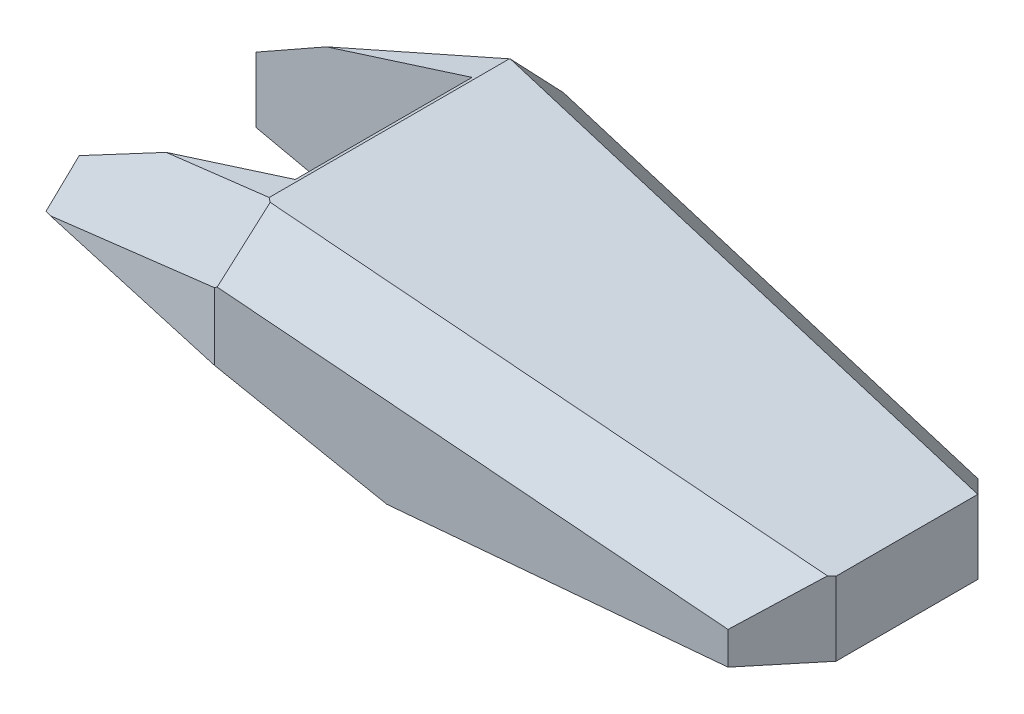
ISO-10303-21;
HEADER;
FILE_DESCRIPTION(('STEP AP214'),'2;1');
FILE_NAME('part.step','',(''),(''),'','','');
FILE_SCHEMA(('AUTOMOTIVE_DESIGN { 1 0 10303 214 1 1 1 1 }'));
ENDSEC;
DATA;
#1=APPLICATION_CONTEXT('core data for automotive mechanical design processes');
#2=APPLICATION_PROTOCOL_DEFINITION('international standard','automotive_design',2000,#1);
#3=PRODUCT_CONTEXT('',#1,'mechanical');
#4=PRODUCT('Part','Part','',(#3));
#5=PRODUCT_RELATED_PRODUCT_CATEGORY('part','',(#4));
#6=PRODUCT_DEFINITION_FORMATION('','',#4);
#7=PRODUCT_DEFINITION_CONTEXT('part definition',#1,'design');
#8=PRODUCT_DEFINITION('design','',#6,#7);
#9=PRODUCT_DEFINITION_SHAPE('','',#8);
#10=(LENGTH_UNIT() NAMED_UNIT(*) SI_UNIT(.MILLI.,.METRE.));
#11=(NAMED_UNIT(*) PLANE_ANGLE_UNIT() SI_UNIT($,.RADIAN.));
#12=(NAMED_UNIT(*) SI_UNIT($,.STERADIAN.) SOLID_ANGLE_UNIT());
#13=UNCERTAINTY_MEASURE_WITH_UNIT(LENGTH_MEASURE(1.E-05),#10,'distance_accuracy_value','');
#14=(GEOMETRIC_REPRESENTATION_CONTEXT(3) GLOBAL_UNCERTAINTY_ASSIGNED_CONTEXT((#13)) GLOBAL_UNIT_ASSIGNED_CONTEXT((#10,
#11,#12)) REPRESENTATION_CONTEXT('',''));
#15=CARTESIAN_POINT('',(0.,0.,0.));
#16=DIRECTION('',(0.,0.,1.));
#17=DIRECTION('',(1.,0.,0.));
#18=AXIS2_PLACEMENT_3D('',#15,#16,#17);
#19=CARTESIAN_POINT('',(75.,0.,35.));
#20=DIRECTION('',(0.,1.,0.));
#21=DIRECTION('',(-1.,0.,0.));
#22=AXIS2_PLACEMENT_3D('',#19,#20,#21);
#23=PLANE('',#22);
#24=DIRECTION('',(0.995536943294782,0.,-0.0943726365811719));
#25=VECTOR('',#24,1.);
#26=CARTESIAN_POINT('',(3.01675074396338,0.,31.8237035980696));
#27=LINE('',#26,#25);
#28=CARTESIAN_POINT('',(1.59268387258015,0.,31.958699035683));
#29=VERTEX_POINT('',#28);
#30=CARTESIAN_POINT('',(65.0446305670522,0.,25.9437263658117));
#31=VERTEX_POINT('',#30);
#32=EDGE_CURVE('E255',#29,#31,#27,.T.);
#33=ORIENTED_EDGE('',*,*,#32,.F.);
#34=DIRECTION('',(-0.975678950603205,0.,-0.219204437340644));
#35=VECTOR('',#34,1.);
#36=CARTESIAN_POINT('',(72.1231881248531,0.,47.804689656279));
#37=LINE('',#36,#35);
#38=CARTESIAN_POINT('',(-60.5374855352448,0.,18.));
#39=VERTEX_POINT('',#38);
#40=EDGE_CURVE('E321',#29,#39,#37,.T.);
#41=ORIENTED_EDGE('',*,*,#40,.T.);
#42=DIRECTION('',(1.,0.,0.));
#43=VECTOR('',#42,1.);
#44=CARTESIAN_POINT('',(0.,0.,18.));
#45=LINE('',#44,#43);
#46=CARTESIAN_POINT('',(-31.,0.,18.));
#47=VERTEX_POINT('',#46);
#48=EDGE_CURVE('E236',#39,#47,#45,.T.);
#49=ORIENTED_EDGE('',*,*,#48,.T.);
#50=DIRECTION('',(0.,0.,-1.));
#51=VECTOR('',#50,1.);
#52=CARTESIAN_POINT('',(-31.,0.,0.));
#53=LINE('',#52,#51);
#54=CARTESIAN_POINT('',(-31.,0.,-18.));
#55=VERTEX_POINT('',#54);
#56=EDGE_CURVE('E225',#47,#55,#53,.T.);
#57=ORIENTED_EDGE('',*,*,#56,.T.);
#58=DIRECTION('',(1.,0.,0.));
#59=VECTOR('',#58,1.);
#60=CARTESIAN_POINT('',(0.,0.,-18.));
#61=LINE('',#60,#59);
#62=CARTESIAN_POINT('',(-60.5374855352447,0.,-18.));
#63=VERTEX_POINT('',#62);
#64=EDGE_CURVE('E212',#63,#55,#61,.T.);
#65=ORIENTED_EDGE('',*,*,#64,.F.);
#66=DIRECTION('',(0.975678950603205,0.,-0.219204437340644));
#67=VECTOR('',#66,1.);
#68=CARTESIAN_POINT('',(-28.2979556265935,0.,-25.2432104939679));
#69=LINE('',#68,#67);
#70=CARTESIAN_POINT('',(1.59268387258016,0.,-31.958699035683));
#71=VERTEX_POINT('',#70);
#72=EDGE_CURVE('E325',#63,#71,#69,.T.);
#73=ORIENTED_EDGE('',*,*,#72,.T.);
#74=DIRECTION('',(0.995536943294782,0.,0.094372636581172));
#75=VECTOR('',#74,1.);
#76=CARTESIAN_POINT('',(3.01675074396338,0.,-31.8237035980697));
#77=LINE('',#76,#75);
#78=CARTESIAN_POINT('',(63.9527699235522,0.,-26.0472300764478));
#79=VERTEX_POINT('',#78);
#80=EDGE_CURVE('E244',#71,#79,#77,.T.);
#81=ORIENTED_EDGE('',*,*,#80,.T.);
#82=DIRECTION('',(0.707106781186545,0.,0.70710678118655));
#83=VECTOR('',#82,1.);
#84=CARTESIAN_POINT('',(63.9527699235522,0.,-26.0472300764478));
#85=LINE('',#84,#83);
#86=CARTESIAN_POINT('',(75.,0.,-15.));
#87=VERTEX_POINT('',#86);
#88=EDGE_CURVE('E103',#79,#87,#85,.T.);
#89=ORIENTED_EDGE('',*,*,#88,.T.);
#90=DIRECTION('',(0.,0.,-1.));
#91=VECTOR('',#90,1.);
#92=CARTESIAN_POINT('',(75.,0.,35.));
#93=LINE('',#92,#91);
#94=CARTESIAN_POINT('',(75.,0.,13.9032444743975));
#95=VERTEX_POINT('',#94);
#96=EDGE_CURVE('E253',#95,#87,#93,.T.);
#97=ORIENTED_EDGE('',*,*,#96,.F.);
#98=DIRECTION('',(0.637219392240469,0.,-0.770682454810467));
#99=VECTOR('',#98,1.);
#100=CARTESIAN_POINT('',(75.,0.,13.9032444743975));
#101=LINE('',#100,#99);
#102=EDGE_CURVE('E316',#95,#31,#101,.F.);
#103=ORIENTED_EDGE('',*,*,#102,.T.);
#104=EDGE_LOOP('',(#33,#41,#49,#57,#65,#73,#81,#89,#97,#103));
#105=FACE_BOUND('',#104,.T.);
#106=ADVANCED_FACE('F80',(#105),#23,.F.);
#107=CARTESIAN_POINT('',(-75.,0.,35.));
#108=DIRECTION('',(1.,0.,0.));
#109=DIRECTION('',(0.,0.,-1.));
#110=AXIS2_PLACEMENT_3D('',#107,#108,#109);
#111=PLANE('',#110);
#112=DIRECTION('',(0.,-0.69834922621373,-0.715757192242372));
#113=VECTOR('',#112,1.);
#114=CARTESIAN_POINT('',(-75.,17.4173625915818,32.6022574710627));
#115=LINE('',#114,#113);
#116=CARTESIAN_POINT('',(-75.,3.17024734577753,18.));
#117=VERTEX_POINT('',#116);
#118=CARTESIAN_POINT('',(-75.,9.76195981958891,24.7560261187721));
#119=VERTEX_POINT('',#118);
#120=EDGE_CURVE('E311',#117,#119,#115,.F.);
#121=ORIENTED_EDGE('',*,*,#120,.T.);
#122=DIRECTION('',(0.,-0.690102523626491,0.723711618591514));
#123=VECTOR('',#122,1.);
#124=CARTESIAN_POINT('',(-75.,20.1608731878628,13.8506690628404));
#125=LINE('',#124,#123);
#126=CARTESIAN_POINT('',(-75.,16.2042367631662,18.));
#127=VERTEX_POINT('',#126);
#128=EDGE_CURVE('E312',#119,#127,#125,.F.);
#129=ORIENTED_EDGE('',*,*,#128,.T.);
#130=DIRECTION('',(0.,-1.,0.));
#131=VECTOR('',#130,1.);
#132=CARTESIAN_POINT('',(-75.,34.2396301233684,18.));
#133=LINE('',#132,#131);
#134=EDGE_CURVE('E245',#127,#117,#133,.T.);
#135=ORIENTED_EDGE('',*,*,#134,.T.);
#136=EDGE_LOOP('',(#121,#129,#135));
#137=FACE_BOUND('',#136,.T.);
#138=ADVANCED_FACE('F411',(#137),#111,.F.);
#139=CARTESIAN_POINT('',(-75.,20.,35.));
#140=DIRECTION('',(0.303171054505346,-0.952936153008226,0.));
#141=DIRECTION('',(0.952936153008226,0.303171054505346,0.));
#142=AXIS2_PLACEMENT_3D('',#139,#140,#141);
#143=PLANE('',#142);
#144=DIRECTION('',(0.,0.,-1.));
#145=VECTOR('',#144,1.);
#146=CARTESIAN_POINT('',(-30.2415768313943,34.2396301233684,35.));
#147=LINE('',#146,#145);
#148=CARTESIAN_POINT('',(-30.2415768313943,34.2396301233684,24.0751899207849));
#149=VERTEX_POINT('',#148);
#150=CARTESIAN_POINT('',(-30.2415768313943,34.2396301233684,-24.8291976010852));
#151=VERTEX_POINT('',#150);
#152=EDGE_CURVE('E247',#149,#151,#147,.T.);
#153=ORIENTED_EDGE('',*,*,#152,.T.);
#154=DIRECTION('',(-0.931819694186912,-0.296452976837638,0.209350638999531));
#155=VECTOR('',#154,1.);
#156=CARTESIAN_POINT('',(-73.0050220744197,20.6346905398685,-15.2215936372511));
#157=LINE('',#156,#155);
#158=CARTESIAN_POINT('',(-60.6383353538242,24.5690794724163,-18.));
#159=VERTEX_POINT('',#158);
#160=EDGE_CURVE('E287',#151,#159,#157,.T.);
#161=ORIENTED_EDGE('',*,*,#160,.T.);
#162=DIRECTION('',(0.952936153008226,0.303171054505346,0.));
#163=VECTOR('',#162,1.);
#164=CARTESIAN_POINT('',(-75.,20.,-18.));
#165=LINE('',#164,#163);
#166=CARTESIAN_POINT('',(-31.,33.9983422353376,-18.));
#167=VERTEX_POINT('',#166);
#168=EDGE_CURVE('E259',#159,#167,#165,.T.);
#169=ORIENTED_EDGE('',*,*,#168,.T.);
#170=DIRECTION('',(0.,0.,-1.));
#171=VECTOR('',#170,1.);
#172=CARTESIAN_POINT('',(-31.,33.9983422353376,35.));
#173=LINE('',#172,#171);
#174=CARTESIAN_POINT('',(-31.,33.9983422353376,18.));
#175=VERTEX_POINT('',#174);
#176=EDGE_CURVE('E229',#175,#167,#173,.T.);
#177=ORIENTED_EDGE('',*,*,#176,.F.);
#178=DIRECTION('',(0.952936153008226,0.303171054505346,0.));
#179=VECTOR('',#178,1.);
#180=CARTESIAN_POINT('',(-75.,20.,18.));
#181=LINE('',#180,#179);
#182=CARTESIAN_POINT('',(-57.2822471688078,25.6367992675489,18.));
#183=VERTEX_POINT('',#182);
#184=EDGE_CURVE('E265',#183,#175,#181,.T.);
#185=ORIENTED_EDGE('',*,*,#184,.F.);
#186=DIRECTION('',(0.931819694186913,0.296452976837638,0.209350638999531));
#187=VECTOR('',#186,1.);
#188=CARTESIAN_POINT('',(-70.9071619975642,21.3021124334521,14.9389092723531));
#189=LINE('',#188,#187);
#190=EDGE_CURVE('E290',#183,#149,#189,.T.);
#191=ORIENTED_EDGE('',*,*,#190,.T.);
#192=EDGE_LOOP('',(#153,#161,#169,#177,#185,#191));
#193=FACE_BOUND('',#192,.T.);
#194=ADVANCED_FACE('F375',(#193),#143,.F.);
#195=DIRECTION('',(0.,-1.,0.));
#196=VECTOR('',#195,1.);
#197=CARTESIAN_POINT('',(-75.,34.2396301233684,-18.));
#198=LINE('',#197,#196);
#199=CARTESIAN_POINT('',(-75.,16.4528024144489,-18.));
#200=VERTEX_POINT('',#199);
#201=CARTESIAN_POINT('',(-75.,3.1702473457776,-18.));
#202=VERTEX_POINT('',#201);
#203=EDGE_CURVE('E235',#200,#202,#198,.T.);
#204=ORIENTED_EDGE('',*,*,#203,.F.);
#205=DIRECTION('',(0.,-0.739743838551892,-0.672888589087757));
#206=VECTOR('',#205,1.);
#207=CARTESIAN_POINT('',(-75.,12.9466069829281,-21.189318753368));
#208=LINE('',#207,#206);
#209=CARTESIAN_POINT('',(-75.,9.41569004807591,-24.4011247741248));
#210=VERTEX_POINT('',#209);
#211=EDGE_CURVE('E300',#200,#210,#208,.T.);
#212=ORIENTED_EDGE('',*,*,#211,.T.);
#213=DIRECTION('',(0.,-0.698349226213734,0.715757192242369));
#214=VECTOR('',#213,1.);
#215=CARTESIAN_POINT('',(-75.,14.8407122269419,-29.9613781500042));
#216=LINE('',#215,#214);
#217=EDGE_CURVE('E294',#210,#202,#216,.T.);
#218=ORIENTED_EDGE('',*,*,#217,.T.);
#219=EDGE_LOOP('',(#204,#212,#218));
#220=FACE_BOUND('',#219,.T.);
#221=ADVANCED_FACE('F379',(#220),#111,.F.);
#222=CARTESIAN_POINT('',(75.,15.,35.));
#223=DIRECTION('',(-1.,0.,0.));
#224=DIRECTION('',(0.,0.,1.));
#225=AXIS2_PLACEMENT_3D('',#222,#223,#224);
#226=PLANE('',#225);
#227=DIRECTION('',(0.,1.,0.));
#228=VECTOR('',#227,1.);
#229=CARTESIAN_POINT('',(75.,15.,-15.));
#230=LINE('',#229,#228);
#231=CARTESIAN_POINT('',(75.,14.9553293177054,-15.));
#232=VERTEX_POINT('',#231);
#233=EDGE_CURVE('E90',#87,#232,#230,.T.);
#234=ORIENTED_EDGE('',*,*,#233,.T.);
#235=DIRECTION('',(0.,0.717363049575828,0.696699544354141));
#236=VECTOR('',#235,1.);
#237=CARTESIAN_POINT('',(75.,8.15486525160468,-21.6045780014046));
#238=LINE('',#237,#236);
#239=CARTESIAN_POINT('',(75.,15.,-14.9566160481515));
#240=VERTEX_POINT('',#239);
#241=EDGE_CURVE('E12',#232,#240,#238,.T.);
#242=ORIENTED_EDGE('',*,*,#241,.T.);
#243=DIRECTION('',(0.,0.,-1.));
#244=VECTOR('',#243,1.);
#245=CARTESIAN_POINT('',(75.,15.,35.));
#246=LINE('',#245,#244);
#247=CARTESIAN_POINT('',(75.,15.,13.9032444743975));
#248=VERTEX_POINT('',#247);
#249=EDGE_CURVE('E252',#248,#240,#246,.T.);
#250=ORIENTED_EDGE('',*,*,#249,.F.);
#251=DIRECTION('',(0.,-1.,0.));
#252=VECTOR('',#251,1.);
#253=CARTESIAN_POINT('',(75.,15.,13.9032444743975));
#254=LINE('',#253,#252);
#255=EDGE_CURVE('E327',#248,#95,#254,.T.);
#256=ORIENTED_EDGE('',*,*,#255,.T.);
#257=ORIENTED_EDGE('',*,*,#96,.T.);
#258=EDGE_LOOP('',(#234,#242,#250,#256,#257));
#259=FACE_BOUND('',#258,.T.);
#260=ADVANCED_FACE('F363',(#259),#226,.F.);
#261=CARTESIAN_POINT('',(-30.2415768313943,34.2396301233684,35.));
#262=DIRECTION('',(-0.179833560165854,-0.983697052266639,0.));
#263=DIRECTION('',(0.983697052266639,-0.179833560165854,0.));
#264=AXIS2_PLACEMENT_3D('',#261,#262,#263);
#265=PLANE('',#264);
#266=DIRECTION('',(-0.979447820558124,0.17905674126175,-0.0928474566838682));
#267=VECTOR('',#266,1.);
#268=CARTESIAN_POINT('',(-31.154914525898,34.4066010102464,-25.0196470962033));
#269=LINE('',#268,#267);
#270=CARTESIAN_POINT('',(-30.1075778658967,34.2151332409507,-24.920364068428));
#271=VERTEX_POINT('',#270);
#272=EDGE_CURVE('E284',#240,#271,#269,.T.);
#273=ORIENTED_EDGE('',*,*,#272,.T.);
#274=DIRECTION('',(-0.817505508675787,0.149451424848343,0.556191527169862));
#275=VECTOR('',#274,1.);
#276=CARTESIAN_POINT('',(-7.73838922917999,30.125733134187,-40.139286824752));
#277=LINE('',#276,#275);
#278=EDGE_CURVE('E283',#271,#151,#277,.T.);
#279=ORIENTED_EDGE('',*,*,#278,.T.);
#280=ORIENTED_EDGE('',*,*,#152,.F.);
#281=DIRECTION('',(-0.791570092430817,0.144710068526324,-0.593696711154924));
#282=VECTOR('',#281,1.);
#283=CARTESIAN_POINT('',(-58.5335993794514,39.411806991629,2.85548884905637));
#284=LINE('',#283,#282);
#285=CARTESIAN_POINT('',(-29.4331359728188,34.0918358431617,24.681540114519));
#286=VERTEX_POINT('',#285);
#287=EDGE_CURVE('E282',#149,#286,#284,.F.);
#288=ORIENTED_EDGE('',*,*,#287,.T.);
#289=DIRECTION('',(0.979447820558125,-0.17905674126175,-0.0928474566838681));
#290=VECTOR('',#289,1.);
#291=CARTESIAN_POINT('',(-31.1729604361361,34.4099000546799,24.8464680189002));
#292=LINE('',#291,#290);
#293=CARTESIAN_POINT('',(74.2118767460622,15.1440799383088,14.8564370034297));
#294=VERTEX_POINT('',#293);
#295=EDGE_CURVE('E276',#286,#294,#292,.T.);
#296=ORIENTED_EDGE('',*,*,#295,.T.);
#297=DIRECTION('',(-0.632939205131007,0.115710126776309,0.765505799566234));
#298=VECTOR('',#297,1.);
#299=CARTESIAN_POINT('',(75.,15.,13.9032444743975));
#300=LINE('',#299,#298);
#301=EDGE_CURVE('E280',#294,#248,#300,.F.);
#302=ORIENTED_EDGE('',*,*,#301,.T.);
#303=ORIENTED_EDGE('',*,*,#249,.T.);
#304=EDGE_LOOP('',(#273,#279,#280,#288,#296,#302,#303));
#305=FACE_BOUND('',#304,.T.);
#306=ADVANCED_FACE('F360',(#305),#265,.F.);
#307=CARTESIAN_POINT('',(0.,34.2396301233684,18.));
#308=DIRECTION('',(0.,0.,-1.));
#309=DIRECTION('',(-1.,0.,0.));
#310=AXIS2_PLACEMENT_3D('',#307,#308,#309);
#311=PLANE('',#310);
#312=ORIENTED_EDGE('',*,*,#134,.F.);
#313=DIRECTION('',(-0.882702418373214,-0.469932378750474,0.));
#314=VECTOR('',#313,1.);
#315=CARTESIAN_POINT('',(-9.08146345977415,51.2978923772385,18.));
#316=LINE('',#315,#314);
#317=EDGE_CURVE('E320',#127,#183,#316,.F.);
#318=ORIENTED_EDGE('',*,*,#317,.T.);
#319=ORIENTED_EDGE('',*,*,#184,.T.);
#320=DIRECTION('',(0.,-1.,0.));
#321=VECTOR('',#320,1.);
#322=CARTESIAN_POINT('',(-31.,34.2396301233684,18.));
#323=LINE('',#322,#321);
#324=EDGE_CURVE('E233',#175,#47,#323,.T.);
#325=ORIENTED_EDGE('',*,*,#324,.T.);
#326=ORIENTED_EDGE('',*,*,#48,.F.);
#327=DIRECTION('',(0.976807257247415,-0.214120485215176,0.));
#328=VECTOR('',#327,1.);
#329=CARTESIAN_POINT('',(-9.93686814080994,-11.0918798650362,18.));
#330=LINE('',#329,#328);
#331=EDGE_CURVE('E314',#39,#117,#330,.F.);
#332=ORIENTED_EDGE('',*,*,#331,.T.);
#333=EDGE_LOOP('',(#312,#318,#319,#325,#326,#332));
#334=FACE_BOUND('',#333,.T.);
#335=ADVANCED_FACE('F412',(#334),#311,.T.);
#336=CARTESIAN_POINT('',(-31.,34.2396301233684,0.));
#337=DIRECTION('',(-1.,0.,0.));
#338=DIRECTION('',(0.,-1.,0.));
#339=AXIS2_PLACEMENT_3D('',#336,#337,#338);
#340=PLANE('',#339);
#341=ORIENTED_EDGE('',*,*,#176,.T.);
#342=DIRECTION('',(0.,-1.,0.));
#343=VECTOR('',#342,1.);
#344=CARTESIAN_POINT('',(-31.,34.2396301233684,-18.));
#345=LINE('',#344,#343);
#346=EDGE_CURVE('E213',#167,#55,#345,.T.);
#347=ORIENTED_EDGE('',*,*,#346,.T.);
#348=ORIENTED_EDGE('',*,*,#56,.F.);
#349=ORIENTED_EDGE('',*,*,#324,.F.);
#350=EDGE_LOOP('',(#341,#347,#348,#349));
#351=FACE_BOUND('',#350,.T.);
#352=ADVANCED_FACE('F227',(#351),#340,.T.);
#353=CARTESIAN_POINT('',(0.,34.2396301233684,-18.));
#354=DIRECTION('',(0.,0.,-1.));
#355=DIRECTION('',(-1.,0.,0.));
#356=AXIS2_PLACEMENT_3D('',#353,#354,#355);
#357=PLANE('',#356);
#358=ORIENTED_EDGE('',*,*,#168,.F.);
#359=DIRECTION('',(-0.870593622996229,-0.492002788201754,0.));
#360=VECTOR('',#359,1.);
#361=CARTESIAN_POINT('',(-18.1305984209761,48.5916826005333,-18.));
#362=LINE('',#361,#360);
#363=EDGE_CURVE('E291',#159,#200,#362,.T.);
#364=ORIENTED_EDGE('',*,*,#363,.T.);
#365=ORIENTED_EDGE('',*,*,#203,.T.);
#366=DIRECTION('',(0.976807257247414,-0.214120485215178,0.));
#367=VECTOR('',#366,1.);
#368=CARTESIAN_POINT('',(51.7562858034433,-24.6152929631562,-18.));
#369=LINE('',#368,#367);
#370=EDGE_CURVE('E216',#202,#63,#369,.T.);
#371=ORIENTED_EDGE('',*,*,#370,.T.);
#372=ORIENTED_EDGE('',*,*,#64,.T.);
#373=ORIENTED_EDGE('',*,*,#346,.F.);
#374=EDGE_LOOP('',(#358,#364,#365,#371,#372,#373));
#375=FACE_BOUND('',#374,.T.);
#376=ADVANCED_FACE('F211',(#375),#357,.F.);
#377=CARTESIAN_POINT('',(3.01675074396337,34.2396301233684,-31.8237035980697));
#378=DIRECTION('',(0.094372636581172,0.,-0.995536943294782));
#379=DIRECTION('',(-0.995536943294782,0.,-0.094372636581172));
#380=AXIS2_PLACEMENT_3D('',#377,#378,#379);
#381=PLANE('',#380);
#382=ORIENTED_EDGE('',*,*,#80,.F.);
#383=DIRECTION('',(-0.950812751482618,0.296363220502025,-0.09013297483009));
#384=VECTOR('',#383,1.);
#385=CARTESIAN_POINT('',(-6.75657268625168,2.60241836125426,-32.7501727828469));
#386=LINE('',#385,#384);
#387=CARTESIAN_POINT('',(-30.49,10.0000000000001,-35.));
#388=VERTEX_POINT('',#387);
#389=EDGE_CURVE('E273',#71,#388,#386,.T.);
#390=ORIENTED_EDGE('',*,*,#389,.T.);
#391=DIRECTION('',(0.,-1.,0.));
#392=VECTOR('',#391,1.);
#393=CARTESIAN_POINT('',(-30.49,34.2396301233684,-35.));
#394=LINE('',#393,#392);
#395=CARTESIAN_POINT('',(-30.49,22.9179089624533,-35.));
#396=VERTEX_POINT('',#395);
#397=EDGE_CURVE('E260',#396,#388,#394,.T.);
#398=ORIENTED_EDGE('',*,*,#397,.F.);
#399=DIRECTION('',(0.828453396958554,0.554524486611477,0.078533832302451));
#400=VECTOR('',#399,1.);
#401=CARTESIAN_POINT('',(-2.08531560116055,41.9305572193781,-32.3073576264253));
#402=LINE('',#401,#400);
#403=CARTESIAN_POINT('',(-29.2861524340744,23.7237031759893,-34.8858804089558));
#404=VERTEX_POINT('',#403);
#405=EDGE_CURVE('E271',#396,#404,#402,.T.);
#406=ORIENTED_EDGE('',*,*,#405,.T.);
#407=DIRECTION('',(0.979447820558124,-0.17905674126175,0.0928474566838682));
#408=VECTOR('',#407,1.);
#409=CARTESIAN_POINT('',(73.1863832307087,4.99029245227252,-25.1719230988047));
#410=LINE('',#409,#408);
#411=CARTESIAN_POINT('',(63.9527699235522,6.67832592802057,-26.0472300764478));
#412=VERTEX_POINT('',#411);
#413=EDGE_CURVE('E272',#404,#412,#410,.T.);
#414=ORIENTED_EDGE('',*,*,#413,.T.);
#415=DIRECTION('',(0.,-1.,0.));
#416=VECTOR('',#415,1.);
#417=CARTESIAN_POINT('',(63.9527699235522,0.,-26.0472300764478));
#418=LINE('',#417,#416);
#419=EDGE_CURVE('E269',#412,#79,#418,.T.);
#420=ORIENTED_EDGE('',*,*,#419,.T.);
#421=EDGE_LOOP('',(#382,#390,#398,#406,#414,#420));
#422=FACE_BOUND('',#421,.T.);
#423=ADVANCED_FACE('F394',(#422),#381,.T.);
#424=CARTESIAN_POINT('',(3.01675074396337,34.2396301233684,31.8237035980696));
#425=DIRECTION('',(-0.0943726365811719,0.,-0.995536943294782));
#426=DIRECTION('',(-0.995536943294782,0.,0.0943726365811719));
#427=AXIS2_PLACEMENT_3D('',#424,#425,#426);
#428=PLANE('',#427);
#429=DIRECTION('',(0.,-1.,0.));
#430=VECTOR('',#429,1.);
#431=CARTESIAN_POINT('',(-30.49,34.2396301233684,35.));
#432=LINE('',#431,#430);
#433=CARTESIAN_POINT('',(-30.49,23.6899118085408,35.));
#434=VERTEX_POINT('',#433);
#435=CARTESIAN_POINT('',(-30.49,9.99999999999995,35.));
#436=VERTEX_POINT('',#435);
#437=EDGE_CURVE('E258',#434,#436,#432,.T.);
#438=ORIENTED_EDGE('',*,*,#437,.T.);
#439=DIRECTION('',(-0.950812751482619,0.296363220502022,0.0901329748300899));
#440=VECTOR('',#439,1.);
#441=CARTESIAN_POINT('',(-11.4321554341841,4.05977235523492,33.1933979935714));
#442=LINE('',#441,#440);
#443=EDGE_CURVE('E304',#436,#29,#442,.F.);
#444=ORIENTED_EDGE('',*,*,#443,.T.);
#445=ORIENTED_EDGE('',*,*,#32,.T.);
#446=DIRECTION('',(0.,1.,0.));
#447=VECTOR('',#446,1.);
#448=CARTESIAN_POINT('',(65.0446305670522,34.2396301233684,25.9437263658117));
#449=LINE('',#448,#447);
#450=CARTESIAN_POINT('',(65.0446305670522,6.655713298162,25.9437263658117));
#451=VERTEX_POINT('',#450);
#452=EDGE_CURVE('E299',#31,#451,#449,.T.);
#453=ORIENTED_EDGE('',*,*,#452,.T.);
#454=DIRECTION('',(-0.979447820558124,0.17905674126175,0.0928474566838681));
#455=VECTOR('',#454,1.);
#456=CARTESIAN_POINT('',(0.167868965552927,18.5160914338347,32.0937653838702));
#457=LINE('',#456,#455);
#458=CARTESIAN_POINT('',(-29.9551521132377,24.0230004065391,34.9492987120332));
#459=VERTEX_POINT('',#458);
#460=EDGE_CURVE('E301',#451,#459,#457,.T.);
#461=ORIENTED_EDGE('',*,*,#460,.T.);
#462=DIRECTION('',(0.84611213861189,0.526935438981792,-0.0802078053476055));
#463=VECTOR('',#462,1.);
#464=CARTESIAN_POINT('',(-59.1280287785465,5.85493275865557,37.7147624209448));
#465=LINE('',#464,#463);
#466=EDGE_CURVE('E303',#459,#434,#465,.F.);
#467=ORIENTED_EDGE('',*,*,#466,.T.);
#468=EDGE_LOOP('',(#438,#444,#445,#453,#461,#467));
#469=FACE_BOUND('',#468,.T.);
#470=ADVANCED_FACE('F402',(#469),#428,.F.);
#471=CARTESIAN_POINT('',(-8.95062278603928,34.2396301233684,-39.8392220206607));
#472=DIRECTION('',(-0.219204437340644,0.,-0.975678950603205));
#473=DIRECTION('',(-0.975678950603205,0.,0.219204437340644));
#474=AXIS2_PLACEMENT_3D('',#471,#472,#473);
#475=PLANE('',#474);
#476=DIRECTION('',(-0.975678950603205,0.,0.219204437340644));
#477=VECTOR('',#476,1.);
#478=CARTESIAN_POINT('',(-75.,10.,-25.));
#479=LINE('',#478,#477);
#480=CARTESIAN_POINT('',(-71.0939504387239,10.0000000000001,-25.8775667403451));
#481=VERTEX_POINT('',#480);
#482=EDGE_CURVE('E261',#388,#481,#479,.T.);
#483=ORIENTED_EDGE('',*,*,#482,.T.);
#484=DIRECTION('',(0.931819694186912,0.296452976837638,-0.209350638999531));
#485=VECTOR('',#484,1.);
#486=CARTESIAN_POINT('',(-27.3843120828013,23.9059653792965,-35.6977505992359));
#487=LINE('',#486,#485);
#488=EDGE_CURVE('E268',#481,#396,#487,.T.);
#489=ORIENTED_EDGE('',*,*,#488,.T.);
#490=ORIENTED_EDGE('',*,*,#397,.T.);
#491=EDGE_LOOP('',(#483,#489,#490));
#492=FACE_BOUND('',#491,.T.);
#493=ADVANCED_FACE('F388',(#492),#475,.T.);
#494=CARTESIAN_POINT('',(-8.95062278603926,34.2396301233684,39.8392220206607));
#495=DIRECTION('',(0.219204437340644,0.,-0.975678950603205));
#496=DIRECTION('',(-0.975678950603205,0.,-0.219204437340644));
#497=AXIS2_PLACEMENT_3D('',#494,#495,#496);
#498=PLANE('',#497);
#499=ORIENTED_EDGE('',*,*,#437,.F.);
#500=DIRECTION('',(-0.931819694186912,-0.296452976837638,-0.209350638999531));
#501=VECTOR('',#500,1.);
#502=CARTESIAN_POINT('',(-7.92933552183223,30.8674550454048,40.0686732145962));
#503=LINE('',#502,#501);
#504=CARTESIAN_POINT('',(-73.5205324337048,9.99999999999993,25.3323899272737));
#505=VERTEX_POINT('',#504);
#506=EDGE_CURVE('E307',#434,#505,#503,.T.);
#507=ORIENTED_EDGE('',*,*,#506,.T.);
#508=DIRECTION('',(0.975678950603205,0.,0.219204437340644));
#509=VECTOR('',#508,1.);
#510=CARTESIAN_POINT('',(-8.95062278603925,9.99999999999995,39.8392220206607));
#511=LINE('',#510,#509);
#512=EDGE_CURVE('E310',#505,#436,#511,.T.);
#513=ORIENTED_EDGE('',*,*,#512,.T.);
#514=EDGE_LOOP('',(#499,#507,#513));
#515=FACE_BOUND('',#514,.T.);
#516=ADVANCED_FACE('F419',(#515),#498,.F.);
#517=CARTESIAN_POINT('',(63.9527699235522,34.2396301233684,-26.0472300764478));
#518=DIRECTION('',(0.70710678118655,0.,-0.707106781186545));
#519=DIRECTION('',(0.,1.,0.));
#520=AXIS2_PLACEMENT_3D('',#517,#518,#519);
#521=PLANE('',#520);
#522=ORIENTED_EDGE('',*,*,#88,.F.);
#523=ORIENTED_EDGE('',*,*,#419,.F.);
#524=DIRECTION('',(0.624834365084404,0.468149583380285,0.624834365084408));
#525=VECTOR('',#524,1.);
#526=CARTESIAN_POINT('',(72.0148909399907,12.7187724942034,-17.9851090600093));
#527=LINE('',#526,#525);
#528=EDGE_CURVE('E221',#232,#412,#527,.F.);
#529=ORIENTED_EDGE('',*,*,#528,.F.);
#530=ORIENTED_EDGE('',*,*,#233,.F.);
#531=EDGE_LOOP('',(#522,#523,#529,#530));
#532=FACE_BOUND('',#531,.T.);
#533=ADVANCED_FACE('F423',(#532),#521,.T.);
#534=CARTESIAN_POINT('',(57.1520672474071,0.,-44.4411486817911));
#535=DIRECTION('',(-0.155000944109751,-0.707106781186546,-0.689909202232502));
#536=DIRECTION('',(-0.975678950603205,0.,0.219204437340644));
#537=AXIS2_PLACEMENT_3D('',#534,#535,#536);
#538=PLANE('',#537);
#539=ORIENTED_EDGE('',*,*,#370,.F.);
#540=ORIENTED_EDGE('',*,*,#217,.F.);
#541=DIRECTION('',(-0.926381600362018,-0.138578371799791,0.35016162750939));
#542=VECTOR('',#541,1.);
#543=CARTESIAN_POINT('',(-9.49675240327816,19.2143879021838,-49.1606016210908));
#544=LINE('',#543,#542);
#545=EDGE_CURVE('E335',#481,#210,#544,.T.);
#546=ORIENTED_EDGE('',*,*,#545,.F.);
#547=ORIENTED_EDGE('',*,*,#482,.F.);
#548=ORIENTED_EDGE('',*,*,#389,.F.);
#549=ORIENTED_EDGE('',*,*,#72,.F.);
#550=EDGE_LOOP('',(#539,#540,#546,#547,#548,#549));
#551=FACE_BOUND('',#550,.T.);
#552=ADVANCED_FACE('F381',(#551),#538,.T.);
#553=CARTESIAN_POINT('',(0.136828204982148,18.3447713729301,-32.0967079149699));
#554=DIRECTION('',(0.191744257607884,0.683772231653739,-0.704052323974338));
#555=DIRECTION('',(-0.979447820558124,0.17905674126175,-0.0928474566838682));
#556=AXIS2_PLACEMENT_3D('',#553,#554,#555);
#557=PLANE('',#556);
#558=ORIENTED_EDGE('',*,*,#528,.T.);
#559=ORIENTED_EDGE('',*,*,#413,.F.);
#560=DIRECTION('',(-0.0566761350545682,0.723880323449682,0.687593697642481));
#561=VECTOR('',#560,1.);
#562=CARTESIAN_POINT('',(-29.0796548465943,21.0862696200005,-37.3911048670629));
#563=LINE('',#562,#561);
#564=EDGE_CURVE('E326',#271,#404,#563,.F.);
#565=ORIENTED_EDGE('',*,*,#564,.F.);
#566=ORIENTED_EDGE('',*,*,#272,.F.);
#567=ORIENTED_EDGE('',*,*,#241,.F.);
#568=EDGE_LOOP('',(#558,#559,#565,#566,#567));
#569=FACE_BOUND('',#568,.T.);
#570=ADVANCED_FACE('F364',(#569),#557,.T.);
#571=CARTESIAN_POINT('',(-7.71607689807497,30.1632991811354,-40.1165857339755));
#572=DIRECTION('',(-0.355440550449735,0.628948217360338,-0.691437744829744));
#573=DIRECTION('',(-0.931819694186912,-0.296452976837638,0.209350638999531));
#574=AXIS2_PLACEMENT_3D('',#571,#572,#573);
#575=PLANE('',#574);
#576=ORIENTED_EDGE('',*,*,#363,.F.);
#577=ORIENTED_EDGE('',*,*,#160,.F.);
#578=ORIENTED_EDGE('',*,*,#278,.F.);
#579=ORIENTED_EDGE('',*,*,#564,.T.);
#580=ORIENTED_EDGE('',*,*,#405,.F.);
#581=ORIENTED_EDGE('',*,*,#488,.F.);
#582=ORIENTED_EDGE('',*,*,#545,.T.);
#583=ORIENTED_EDGE('',*,*,#211,.F.);
#584=EDGE_LOOP('',(#576,#577,#578,#579,#580,#581,#582,#583));
#585=FACE_BOUND('',#584,.T.);
#586=ADVANCED_FACE('F376',(#585),#575,.T.);
#587=CARTESIAN_POINT('',(75.,15.,13.9032444743975));
#588=DIRECTION('',(-0.770682454810467,0.,-0.637219392240469));
#589=DIRECTION('',(0.,-1.,0.));
#590=AXIS2_PLACEMENT_3D('',#587,#588,#589);
#591=PLANE('',#590);
#592=ORIENTED_EDGE('',*,*,#255,.F.);
#593=ORIENTED_EDGE('',*,*,#301,.F.);
#594=DIRECTION('',(-0.548810225989448,-0.508168137202064,0.663756340973098));
#595=VECTOR('',#594,1.);
#596=CARTESIAN_POINT('',(74.7562969581351,15.648183163655,14.197990147295));
#597=LINE('',#596,#595);
#598=EDGE_CURVE('E85',#451,#294,#597,.F.);
#599=ORIENTED_EDGE('',*,*,#598,.F.);
#600=ORIENTED_EDGE('',*,*,#452,.F.);
#601=ORIENTED_EDGE('',*,*,#102,.F.);
#602=EDGE_LOOP('',(#592,#593,#599,#600,#601));
#603=FACE_BOUND('',#602,.T.);
#604=ADVANCED_FACE('F78',(#603),#591,.F.);
#605=CARTESIAN_POINT('',(-8.95062278603925,9.99999999999996,39.8392220206607));
#606=DIRECTION('',(0.15500094410975,0.70710678118655,-0.689909202232499));
#607=DIRECTION('',(0.975678950603205,0.,0.219204437340644));
#608=AXIS2_PLACEMENT_3D('',#605,#606,#607);
#609=PLANE('',#608);
#610=ORIENTED_EDGE('',*,*,#443,.F.);
#611=ORIENTED_EDGE('',*,*,#512,.F.);
#612=DIRECTION('',(-0.92149020836748,-0.148263943356384,-0.358989692029275));
#613=VECTOR('',#612,1.);
#614=CARTESIAN_POINT('',(-13.8924282534555,19.5939140539445,48.5620179380586));
#615=LINE('',#614,#613);
#616=EDGE_CURVE('E339',#119,#505,#615,.F.);
#617=ORIENTED_EDGE('',*,*,#616,.F.);
#618=ORIENTED_EDGE('',*,*,#120,.F.);
#619=ORIENTED_EDGE('',*,*,#331,.F.);
#620=ORIENTED_EDGE('',*,*,#40,.F.);
#621=EDGE_LOOP('',(#610,#611,#617,#618,#619,#620));
#622=FACE_BOUND('',#621,.T.);
#623=ADVANCED_FACE('F407',(#622),#609,.F.);
#624=CARTESIAN_POINT('',(-31.1729604361361,34.4099000546799,24.8464680189002));
#625=DIRECTION('',(-0.19277868965967,-0.695679050787329,-0.692002192994171));
#626=DIRECTION('',(0.979447820558124,-0.17905674126175,-0.0928474566838681));
#627=AXIS2_PLACEMENT_3D('',#624,#625,#626);
#628=PLANE('',#627);
#629=ORIENTED_EDGE('',*,*,#598,.T.);
#630=ORIENTED_EDGE('',*,*,#295,.F.);
#631=DIRECTION('',(-0.0362755494358514,-0.699695870226515,0.713519287546656));
#632=VECTOR('',#631,1.);
#633=CARTESIAN_POINT('',(-29.4316212551081,34.1210522642282,24.6517464844132));
#634=LINE('',#633,#632);
#635=EDGE_CURVE('E340',#459,#286,#634,.F.);
#636=ORIENTED_EDGE('',*,*,#635,.F.);
#637=ORIENTED_EDGE('',*,*,#460,.F.);
#638=EDGE_LOOP('',(#629,#630,#636,#637));
#639=FACE_BOUND('',#638,.T.);
#640=ADVANCED_FACE('F348',(#639),#628,.F.);
#641=CARTESIAN_POINT('',(-70.9071619975642,21.3021124334521,14.9389092723531));
#642=DIRECTION('',(0.359526580859256,-0.675320528535932,-0.643958710938522));
#643=DIRECTION('',(0.931819694186912,0.296452976837638,0.209350638999531));
#644=AXIS2_PLACEMENT_3D('',#641,#642,#643);
#645=PLANE('',#644);
#646=ORIENTED_EDGE('',*,*,#616,.T.);
#647=ORIENTED_EDGE('',*,*,#506,.F.);
#648=ORIENTED_EDGE('',*,*,#466,.F.);
#649=ORIENTED_EDGE('',*,*,#635,.T.);
#650=ORIENTED_EDGE('',*,*,#287,.F.);
#651=ORIENTED_EDGE('',*,*,#190,.F.);
#652=ORIENTED_EDGE('',*,*,#317,.F.);
#653=ORIENTED_EDGE('',*,*,#128,.F.);
#654=EDGE_LOOP('',(#646,#647,#648,#649,#650,#651,#652,#653));
#655=FACE_BOUND('',#654,.T.);
#656=ADVANCED_FACE('F413',(#655),#645,.F.);
#657=CLOSED_SHELL('',(#106,#138,#194,#221,#260,#306,#335,#352,#376,#423,#470,#493,#516,#533,
#552,#570,#586,#604,#623,#640,#656));
#658=MANIFOLD_SOLID_BREP('B2',#657);
#659=ADVANCED_BREP_SHAPE_REPRESENTATION('',(#18,#658),#14);
#660=SHAPE_DEFINITION_REPRESENTATION(#9,#659);
ENDSEC;
END-ISO-10303-21;
